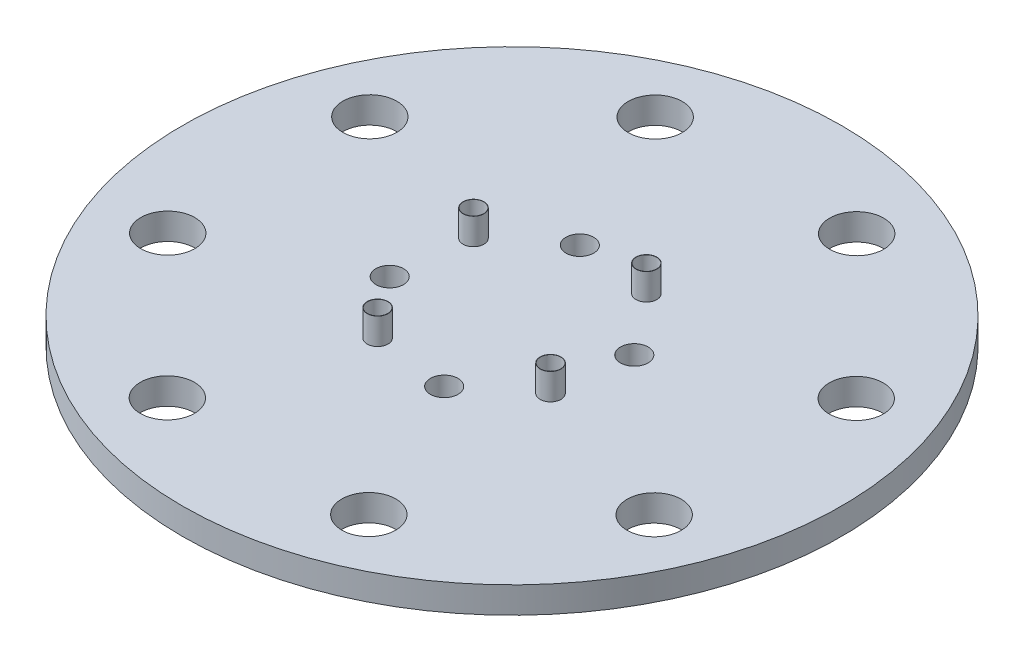
ISO-10303-21;
HEADER;
FILE_DESCRIPTION(('STEP AP214'),'2;1');
FILE_NAME('part.step','',(''),(''),'','','');
FILE_SCHEMA(('AUTOMOTIVE_DESIGN { 1 0 10303 214 1 1 1 1 }'));
ENDSEC;
DATA;
#1=APPLICATION_CONTEXT('core data for automotive mechanical design processes');
#2=APPLICATION_PROTOCOL_DEFINITION('international standard','automotive_design',2000,#1);
#3=PRODUCT_CONTEXT('',#1,'mechanical');
#4=PRODUCT('Part','Part','',(#3));
#5=PRODUCT_RELATED_PRODUCT_CATEGORY('part','',(#4));
#6=PRODUCT_DEFINITION_FORMATION('','',#4);
#7=PRODUCT_DEFINITION_CONTEXT('part definition',#1,'design');
#8=PRODUCT_DEFINITION('design','',#6,#7);
#9=PRODUCT_DEFINITION_SHAPE('','',#8);
#10=(LENGTH_UNIT() NAMED_UNIT(*) SI_UNIT(.MILLI.,.METRE.));
#11=(NAMED_UNIT(*) PLANE_ANGLE_UNIT() SI_UNIT($,.RADIAN.));
#12=(NAMED_UNIT(*) SI_UNIT($,.STERADIAN.) SOLID_ANGLE_UNIT());
#13=UNCERTAINTY_MEASURE_WITH_UNIT(LENGTH_MEASURE(1.E-05),#10,'distance_accuracy_value','');
#14=(GEOMETRIC_REPRESENTATION_CONTEXT(3) GLOBAL_UNCERTAINTY_ASSIGNED_CONTEXT((#13)) GLOBAL_UNIT_ASSIGNED_CONTEXT((#10,
#11,#12)) REPRESENTATION_CONTEXT('',''));
#15=CARTESIAN_POINT('',(0.,0.,0.));
#16=DIRECTION('',(0.,0.,1.));
#17=DIRECTION('',(1.,0.,0.));
#18=AXIS2_PLACEMENT_3D('',#15,#16,#17);
#19=CARTESIAN_POINT('',(0.,2.,0.));
#20=DIRECTION('',(0.,-1.,0.));
#21=DIRECTION('',(0.,0.,-1.));
#22=AXIS2_PLACEMENT_3D('',#19,#20,#21);
#23=CYLINDRICAL_SURFACE('',#22,25.);
#24=CARTESIAN_POINT('',(0.,2.,0.));
#25=DIRECTION('',(0.,1.,0.));
#26=DIRECTION('',(0.,0.,1.));
#27=AXIS2_PLACEMENT_3D('',#24,#25,#26);
#28=CIRCLE('',#27,25.);
#29=CARTESIAN_POINT('',(0.,2.,25.));
#30=VERTEX_POINT('',#29);
#31=EDGE_CURVE('E10',#30,#30,#28,.T.);
#32=ORIENTED_EDGE('',*,*,#31,.F.);
#33=EDGE_LOOP('',(#32));
#34=FACE_BOUND('',#33,.T.);
#35=CARTESIAN_POINT('',(0.,0.,0.));
#36=DIRECTION('',(0.,1.,0.));
#37=DIRECTION('',(0.,0.,1.));
#38=AXIS2_PLACEMENT_3D('',#35,#36,#37);
#39=CIRCLE('',#38,25.);
#40=CARTESIAN_POINT('',(0.,0.,25.));
#41=VERTEX_POINT('',#40);
#42=EDGE_CURVE('E44',#41,#41,#39,.T.);
#43=ORIENTED_EDGE('',*,*,#42,.T.);
#44=EDGE_LOOP('',(#43));
#45=FACE_BOUND('',#44,.T.);
#46=ADVANCED_FACE('F41',(#34,#45),#23,.T.);
#47=CARTESIAN_POINT('',(0.,2.,0.));
#48=DIRECTION('',(0.,1.,0.));
#49=DIRECTION('',(0.,0.,1.));
#50=AXIS2_PLACEMENT_3D('',#47,#48,#49);
#51=PLANE('',#50);
#52=CARTESIAN_POINT('',(-7.68064256948644,2.,18.4663946053315));
#53=DIRECTION('',(0.,-1.,0.));
#54=DIRECTION('',(0.,0.,-1.));
#55=AXIS2_PLACEMENT_3D('',#52,#53,#54);
#56=CIRCLE('',#55,2.05);
#57=CARTESIAN_POINT('',(-7.68064256948644,2.,16.4163946053315));
#58=VERTEX_POINT('',#57);
#59=EDGE_CURVE('E107',#58,#58,#56,.T.);
#60=ORIENTED_EDGE('',*,*,#59,.T.);
#61=EDGE_LOOP('',(#60));
#62=FACE_BOUND('',#61,.T.);
#63=CARTESIAN_POINT('',(7.62667840474221,2.,18.488747294251));
#64=DIRECTION('',(0.,-1.,0.));
#65=DIRECTION('',(0.,0.,-1.));
#66=AXIS2_PLACEMENT_3D('',#63,#64,#65);
#67=CIRCLE('',#66,2.05);
#68=CARTESIAN_POINT('',(7.62667840474221,2.,16.438747294251));
#69=VERTEX_POINT('',#68);
#70=EDGE_CURVE('E132',#69,#69,#67,.T.);
#71=ORIENTED_EDGE('',*,*,#70,.T.);
#72=EDGE_LOOP('',(#71));
#73=FACE_BOUND('',#72,.T.);
#74=CARTESIAN_POINT('',(18.4663946053311,2.,7.68064256948754));
#75=DIRECTION('',(0.,-1.,0.));
#76=DIRECTION('',(0.,0.,-1.));
#77=AXIS2_PLACEMENT_3D('',#74,#75,#76);
#78=CIRCLE('',#77,2.05);
#79=CARTESIAN_POINT('',(18.4663946053311,2.,5.63064256948754));
#80=VERTEX_POINT('',#79);
#81=EDGE_CURVE('E124',#80,#80,#78,.T.);
#82=ORIENTED_EDGE('',*,*,#81,.T.);
#83=EDGE_LOOP('',(#82));
#84=FACE_BOUND('',#83,.T.);
#85=CARTESIAN_POINT('',(18.4887472942505,2.,-7.62667840474111));
#86=DIRECTION('',(0.,-1.,0.));
#87=DIRECTION('',(0.,0.,-1.));
#88=AXIS2_PLACEMENT_3D('',#85,#86,#87);
#89=CIRCLE('',#88,2.05);
#90=CARTESIAN_POINT('',(18.4887472942505,2.,-9.67667840474111));
#91=VERTEX_POINT('',#90);
#92=EDGE_CURVE('E115',#91,#91,#89,.T.);
#93=ORIENTED_EDGE('',*,*,#92,.T.);
#94=EDGE_LOOP('',(#93));
#95=FACE_BOUND('',#94,.T.);
#96=CARTESIAN_POINT('',(7.6806425694871,2.,-18.46639460533));
#97=DIRECTION('',(0.,-1.,0.));
#98=DIRECTION('',(0.,0.,-1.));
#99=AXIS2_PLACEMENT_3D('',#96,#97,#98);
#100=CIRCLE('',#99,2.05);
#101=CARTESIAN_POINT('',(7.6806425694871,2.,-20.51639460533));
#102=VERTEX_POINT('',#101);
#103=EDGE_CURVE('E116',#102,#102,#100,.T.);
#104=ORIENTED_EDGE('',*,*,#103,.T.);
#105=EDGE_LOOP('',(#104));
#106=FACE_BOUND('',#105,.T.);
#107=CARTESIAN_POINT('',(-7.62667840474155,2.,-18.4887472942494));
#108=DIRECTION('',(0.,-1.,0.));
#109=DIRECTION('',(0.,0.,-1.));
#110=AXIS2_PLACEMENT_3D('',#107,#108,#109);
#111=CIRCLE('',#110,2.05);
#112=CARTESIAN_POINT('',(-7.62667840474155,2.,-20.5387472942494));
#113=VERTEX_POINT('',#112);
#114=EDGE_CURVE('E156',#113,#113,#111,.T.);
#115=ORIENTED_EDGE('',*,*,#114,.T.);
#116=EDGE_LOOP('',(#115));
#117=FACE_BOUND('',#116,.T.);
#118=CARTESIAN_POINT('',(-18.4663946053304,2.,-7.68064256948599));
#119=DIRECTION('',(0.,-1.,0.));
#120=DIRECTION('',(0.,0.,-1.));
#121=AXIS2_PLACEMENT_3D('',#118,#119,#120);
#122=CIRCLE('',#121,2.05);
#123=CARTESIAN_POINT('',(-18.4663946053304,2.,-9.73064256948599));
#124=VERTEX_POINT('',#123);
#125=EDGE_CURVE('E147',#124,#124,#122,.T.);
#126=ORIENTED_EDGE('',*,*,#125,.T.);
#127=EDGE_LOOP('',(#126));
#128=FACE_BOUND('',#127,.T.);
#129=CARTESIAN_POINT('',(-18.4887472942499,2.,7.62667840474266));
#130=DIRECTION('',(0.,-1.,0.));
#131=DIRECTION('',(0.,0.,-1.));
#132=AXIS2_PLACEMENT_3D('',#129,#130,#131);
#133=CIRCLE('',#132,2.05);
#134=CARTESIAN_POINT('',(-18.4887472942499,2.,5.57667840474266));
#135=VERTEX_POINT('',#134);
#136=EDGE_CURVE('E96',#135,#135,#133,.T.);
#137=ORIENTED_EDGE('',*,*,#136,.T.);
#138=EDGE_LOOP('',(#137));
#139=FACE_BOUND('',#138,.T.);
#140=CARTESIAN_POINT('',(-7.20972393812874,2.,2.06636897382066));
#141=DIRECTION('',(0.,1.,0.));
#142=DIRECTION('',(0.,0.,1.));
#143=AXIS2_PLACEMENT_3D('',#140,#141,#142);
#144=CIRCLE('',#143,1.05);
#145=CARTESIAN_POINT('',(-7.20972393812874,2.,3.11636897382066));
#146=VERTEX_POINT('',#145);
#147=EDGE_CURVE('E75',#146,#146,#144,.T.);
#148=ORIENTED_EDGE('',*,*,#147,.F.);
#149=EDGE_LOOP('',(#148));
#150=FACE_BOUND('',#149,.T.);
#151=CARTESIAN_POINT('',(2.06636897382105,2.,7.20972393812896));
#152=DIRECTION('',(0.,1.,0.));
#153=DIRECTION('',(0.,0.,1.));
#154=AXIS2_PLACEMENT_3D('',#151,#152,#153);
#155=CIRCLE('',#154,1.05);
#156=CARTESIAN_POINT('',(2.06636897382105,2.,8.25972393812896));
#157=VERTEX_POINT('',#156);
#158=EDGE_CURVE('E84',#157,#157,#155,.T.);
#159=ORIENTED_EDGE('',*,*,#158,.F.);
#160=EDGE_LOOP('',(#159));
#161=FACE_BOUND('',#160,.T.);
#162=CARTESIAN_POINT('',(7.20972393812935,2.,-2.06636897382083));
#163=DIRECTION('',(0.,1.,0.));
#164=DIRECTION('',(0.,0.,1.));
#165=AXIS2_PLACEMENT_3D('',#162,#163,#164);
#166=CIRCLE('',#165,1.05);
#167=CARTESIAN_POINT('',(7.20972393812935,2.,-1.01636897382083));
#168=VERTEX_POINT('',#167);
#169=EDGE_CURVE('E63',#168,#168,#166,.T.);
#170=ORIENTED_EDGE('',*,*,#169,.F.);
#171=EDGE_LOOP('',(#170));
#172=FACE_BOUND('',#171,.T.);
#173=CARTESIAN_POINT('',(-3.63690117331162,2.,6.55918820095631));
#174=DIRECTION('',(0.,1.,0.));
#175=DIRECTION('',(0.,0.,1.));
#176=AXIS2_PLACEMENT_3D('',#173,#174,#175);
#177=CIRCLE('',#176,0.79375);
#178=CARTESIAN_POINT('',(-3.63690117331162,2.,7.35293820095631));
#179=VERTEX_POINT('',#178);
#180=EDGE_CURVE('E59',#179,#179,#177,.T.);
#181=ORIENTED_EDGE('',*,*,#180,.F.);
#182=EDGE_LOOP('',(#181));
#183=FACE_BOUND('',#182,.T.);
#184=CARTESIAN_POINT('',(-6.5591882009563,2.,-3.63690117331165));
#185=DIRECTION('',(0.,1.,0.));
#186=DIRECTION('',(0.,0.,1.));
#187=AXIS2_PLACEMENT_3D('',#184,#185,#186);
#188=CIRCLE('',#187,0.79375);
#189=CARTESIAN_POINT('',(-6.5591882009563,2.,-2.84315117331165));
#190=VERTEX_POINT('',#189);
#191=EDGE_CURVE('E80',#190,#190,#188,.T.);
#192=ORIENTED_EDGE('',*,*,#191,.F.);
#193=EDGE_LOOP('',(#192));
#194=FACE_BOUND('',#193,.T.);
#195=CARTESIAN_POINT('',(3.63690117331167,2.,-6.55918820095629));
#196=DIRECTION('',(0.,1.,0.));
#197=DIRECTION('',(0.,0.,1.));
#198=AXIS2_PLACEMENT_3D('',#195,#196,#197);
#199=CIRCLE('',#198,0.79375);
#200=CARTESIAN_POINT('',(3.63690117331167,2.,-5.76543820095629));
#201=VERTEX_POINT('',#200);
#202=EDGE_CURVE('E95',#201,#201,#199,.T.);
#203=ORIENTED_EDGE('',*,*,#202,.F.);
#204=EDGE_LOOP('',(#203));
#205=FACE_BOUND('',#204,.T.);
#206=CARTESIAN_POINT('',(6.55918820095628,2.,3.63690117331169));
#207=DIRECTION('',(0.,1.,0.));
#208=DIRECTION('',(0.,0.,1.));
#209=AXIS2_PLACEMENT_3D('',#206,#207,#208);
#210=CIRCLE('',#209,0.79375);
#211=CARTESIAN_POINT('',(6.55918820095628,2.,4.43065117331169));
#212=VERTEX_POINT('',#211);
#213=EDGE_CURVE('E91',#212,#212,#210,.T.);
#214=ORIENTED_EDGE('',*,*,#213,.F.);
#215=EDGE_LOOP('',(#214));
#216=FACE_BOUND('',#215,.T.);
#217=CARTESIAN_POINT('',(-2.06636897382044,2.,-7.20972393812913));
#218=DIRECTION('',(0.,1.,0.));
#219=DIRECTION('',(0.,0.,1.));
#220=AXIS2_PLACEMENT_3D('',#217,#218,#219);
#221=CIRCLE('',#220,1.05);
#222=CARTESIAN_POINT('',(-2.06636897382044,2.,-6.15972393812913));
#223=VERTEX_POINT('',#222);
#224=EDGE_CURVE('E55',#223,#223,#221,.T.);
#225=ORIENTED_EDGE('',*,*,#224,.F.);
#226=EDGE_LOOP('',(#225));
#227=FACE_BOUND('',#226,.T.);
#228=ORIENTED_EDGE('',*,*,#31,.T.);
#229=EDGE_LOOP('',(#228));
#230=FACE_BOUND('',#229,.T.);
#231=ADVANCED_FACE('F232',(#62,#73,#84,#95,#106,#117,#128,#139,#150,#161,#172,#183,#194,#205,
#216,#227,#230),#51,.T.);
#232=CARTESIAN_POINT('',(0.,0.,0.));
#233=DIRECTION('',(0.,1.,0.));
#234=DIRECTION('',(0.,0.,1.));
#235=AXIS2_PLACEMENT_3D('',#232,#233,#234);
#236=PLANE('',#235);
#237=CARTESIAN_POINT('',(-7.68064256948644,0.,18.4663946053315));
#238=DIRECTION('',(0.,-1.,0.));
#239=DIRECTION('',(0.,0.,-1.));
#240=AXIS2_PLACEMENT_3D('',#237,#238,#239);
#241=CIRCLE('',#240,2.05);
#242=CARTESIAN_POINT('',(-7.68064256948644,0.,16.4163946053315));
#243=VERTEX_POINT('',#242);
#244=EDGE_CURVE('E136',#243,#243,#241,.T.);
#245=ORIENTED_EDGE('',*,*,#244,.F.);
#246=EDGE_LOOP('',(#245));
#247=FACE_BOUND('',#246,.T.);
#248=CARTESIAN_POINT('',(7.62667840474221,0.,18.488747294251));
#249=DIRECTION('',(0.,-1.,0.));
#250=DIRECTION('',(0.,0.,-1.));
#251=AXIS2_PLACEMENT_3D('',#248,#249,#250);
#252=CIRCLE('',#251,2.05);
#253=CARTESIAN_POINT('',(7.62667840474221,0.,16.438747294251));
#254=VERTEX_POINT('',#253);
#255=EDGE_CURVE('E128',#254,#254,#252,.T.);
#256=ORIENTED_EDGE('',*,*,#255,.F.);
#257=EDGE_LOOP('',(#256));
#258=FACE_BOUND('',#257,.T.);
#259=CARTESIAN_POINT('',(18.4663946053311,0.,7.68064256948754));
#260=DIRECTION('',(0.,-1.,0.));
#261=DIRECTION('',(0.,0.,-1.));
#262=AXIS2_PLACEMENT_3D('',#259,#260,#261);
#263=CIRCLE('',#262,2.05);
#264=CARTESIAN_POINT('',(18.4663946053311,0.,5.63064256948754));
#265=VERTEX_POINT('',#264);
#266=EDGE_CURVE('E120',#265,#265,#263,.T.);
#267=ORIENTED_EDGE('',*,*,#266,.F.);
#268=EDGE_LOOP('',(#267));
#269=FACE_BOUND('',#268,.T.);
#270=CARTESIAN_POINT('',(18.4887472942505,0.,-7.62667840474111));
#271=DIRECTION('',(0.,-1.,0.));
#272=DIRECTION('',(0.,0.,-1.));
#273=AXIS2_PLACEMENT_3D('',#270,#271,#272);
#274=CIRCLE('',#273,2.05);
#275=CARTESIAN_POINT('',(18.4887472942505,0.,-9.67667840474111));
#276=VERTEX_POINT('',#275);
#277=EDGE_CURVE('E111',#276,#276,#274,.T.);
#278=ORIENTED_EDGE('',*,*,#277,.F.);
#279=EDGE_LOOP('',(#278));
#280=FACE_BOUND('',#279,.T.);
#281=CARTESIAN_POINT('',(7.6806425694871,0.,-18.46639460533));
#282=DIRECTION('',(0.,-1.,0.));
#283=DIRECTION('',(0.,0.,-1.));
#284=AXIS2_PLACEMENT_3D('',#281,#282,#283);
#285=CIRCLE('',#284,2.05);
#286=CARTESIAN_POINT('',(7.6806425694871,0.,-20.51639460533));
#287=VERTEX_POINT('',#286);
#288=EDGE_CURVE('E160',#287,#287,#285,.T.);
#289=ORIENTED_EDGE('',*,*,#288,.F.);
#290=EDGE_LOOP('',(#289));
#291=FACE_BOUND('',#290,.T.);
#292=CARTESIAN_POINT('',(-7.62667840474155,0.,-18.4887472942494));
#293=DIRECTION('',(0.,-1.,0.));
#294=DIRECTION('',(0.,0.,-1.));
#295=AXIS2_PLACEMENT_3D('',#292,#293,#294);
#296=CIRCLE('',#295,2.05);
#297=CARTESIAN_POINT('',(-7.62667840474155,0.,-20.5387472942494));
#298=VERTEX_POINT('',#297);
#299=EDGE_CURVE('E152',#298,#298,#296,.T.);
#300=ORIENTED_EDGE('',*,*,#299,.F.);
#301=EDGE_LOOP('',(#300));
#302=FACE_BOUND('',#301,.T.);
#303=CARTESIAN_POINT('',(-18.4663946053304,0.,-7.68064256948599));
#304=DIRECTION('',(0.,-1.,0.));
#305=DIRECTION('',(0.,0.,-1.));
#306=AXIS2_PLACEMENT_3D('',#303,#304,#305);
#307=CIRCLE('',#306,2.05);
#308=CARTESIAN_POINT('',(-18.4663946053304,0.,-9.73064256948599));
#309=VERTEX_POINT('',#308);
#310=EDGE_CURVE('E143',#309,#309,#307,.T.);
#311=ORIENTED_EDGE('',*,*,#310,.F.);
#312=EDGE_LOOP('',(#311));
#313=FACE_BOUND('',#312,.T.);
#314=CARTESIAN_POINT('',(-18.4887472942499,0.,7.62667840474266));
#315=DIRECTION('',(0.,-1.,0.));
#316=DIRECTION('',(0.,0.,-1.));
#317=AXIS2_PLACEMENT_3D('',#314,#315,#316);
#318=CIRCLE('',#317,2.05);
#319=CARTESIAN_POINT('',(-18.4887472942499,0.,5.57667840474266));
#320=VERTEX_POINT('',#319);
#321=EDGE_CURVE('E103',#320,#320,#318,.T.);
#322=ORIENTED_EDGE('',*,*,#321,.F.);
#323=EDGE_LOOP('',(#322));
#324=FACE_BOUND('',#323,.T.);
#325=CARTESIAN_POINT('',(-7.20972393812874,0.,2.06636897382066));
#326=DIRECTION('',(0.,1.,0.));
#327=DIRECTION('',(0.,0.,1.));
#328=AXIS2_PLACEMENT_3D('',#325,#326,#327);
#329=CIRCLE('',#328,1.05);
#330=CARTESIAN_POINT('',(-7.20972393812874,0.,3.11636897382066));
#331=VERTEX_POINT('',#330);
#332=EDGE_CURVE('E79',#331,#331,#329,.T.);
#333=ORIENTED_EDGE('',*,*,#332,.T.);
#334=EDGE_LOOP('',(#333));
#335=FACE_BOUND('',#334,.T.);
#336=CARTESIAN_POINT('',(2.06636897382105,0.,7.20972393812896));
#337=DIRECTION('',(0.,1.,0.));
#338=DIRECTION('',(0.,0.,1.));
#339=AXIS2_PLACEMENT_3D('',#336,#337,#338);
#340=CIRCLE('',#339,1.05);
#341=CARTESIAN_POINT('',(2.06636897382105,0.,8.25972393812896));
#342=VERTEX_POINT('',#341);
#343=EDGE_CURVE('E68',#342,#342,#340,.T.);
#344=ORIENTED_EDGE('',*,*,#343,.T.);
#345=EDGE_LOOP('',(#344));
#346=FACE_BOUND('',#345,.T.);
#347=CARTESIAN_POINT('',(7.20972393812935,0.,-2.06636897382083));
#348=DIRECTION('',(0.,1.,0.));
#349=DIRECTION('',(0.,0.,1.));
#350=AXIS2_PLACEMENT_3D('',#347,#348,#349);
#351=CIRCLE('',#350,1.05);
#352=CARTESIAN_POINT('',(7.20972393812935,0.,-1.01636897382083));
#353=VERTEX_POINT('',#352);
#354=EDGE_CURVE('E67',#353,#353,#351,.T.);
#355=ORIENTED_EDGE('',*,*,#354,.T.);
#356=EDGE_LOOP('',(#355));
#357=FACE_BOUND('',#356,.T.);
#358=CARTESIAN_POINT('',(-2.06636897382044,0.,-7.20972393812913));
#359=DIRECTION('',(0.,1.,0.));
#360=DIRECTION('',(0.,0.,1.));
#361=AXIS2_PLACEMENT_3D('',#358,#359,#360);
#362=CIRCLE('',#361,1.05);
#363=CARTESIAN_POINT('',(-2.06636897382044,0.,-6.15972393812913));
#364=VERTEX_POINT('',#363);
#365=EDGE_CURVE('E53',#364,#364,#362,.T.);
#366=ORIENTED_EDGE('',*,*,#365,.T.);
#367=EDGE_LOOP('',(#366));
#368=FACE_BOUND('',#367,.T.);
#369=ORIENTED_EDGE('',*,*,#42,.F.);
#370=EDGE_LOOP('',(#369));
#371=FACE_BOUND('',#370,.T.);
#372=CARTESIAN_POINT('',(-3.63690117331162,0.,6.55918820095631));
#373=DIRECTION('',(0.,1.,0.));
#374=DIRECTION('',(0.,0.,1.));
#375=AXIS2_PLACEMENT_3D('',#372,#373,#374);
#376=CIRCLE('',#375,0.773750000000001);
#377=CARTESIAN_POINT('',(-3.63690117331162,0.,7.33293820095632));
#378=VERTEX_POINT('',#377);
#379=EDGE_CURVE('E171',#378,#378,#376,.T.);
#380=ORIENTED_EDGE('',*,*,#379,.T.);
#381=EDGE_LOOP('',(#380));
#382=FACE_BOUND('',#381,.T.);
#383=CARTESIAN_POINT('',(-6.5591882009563,0.,-3.63690117331165));
#384=DIRECTION('',(0.,1.,0.));
#385=DIRECTION('',(0.,0.,1.));
#386=AXIS2_PLACEMENT_3D('',#383,#384,#385);
#387=CIRCLE('',#386,0.77375);
#388=CARTESIAN_POINT('',(-6.5591882009563,0.,-2.86315117331165));
#389=VERTEX_POINT('',#388);
#390=EDGE_CURVE('E175',#389,#389,#387,.T.);
#391=ORIENTED_EDGE('',*,*,#390,.T.);
#392=EDGE_LOOP('',(#391));
#393=FACE_BOUND('',#392,.T.);
#394=CARTESIAN_POINT('',(6.55918820095628,0.,3.63690117331169));
#395=DIRECTION('',(0.,1.,0.));
#396=DIRECTION('',(0.,0.,1.));
#397=AXIS2_PLACEMENT_3D('',#394,#395,#396);
#398=CIRCLE('',#397,0.77375);
#399=CARTESIAN_POINT('',(6.55918820095628,0.,4.41065117331169));
#400=VERTEX_POINT('',#399);
#401=EDGE_CURVE('E190',#400,#400,#398,.T.);
#402=ORIENTED_EDGE('',*,*,#401,.T.);
#403=EDGE_LOOP('',(#402));
#404=FACE_BOUND('',#403,.T.);
#405=CARTESIAN_POINT('',(3.63690117331167,0.,-6.55918820095629));
#406=DIRECTION('',(0.,1.,0.));
#407=DIRECTION('',(0.,0.,1.));
#408=AXIS2_PLACEMENT_3D('',#405,#406,#407);
#409=CIRCLE('',#408,0.77375);
#410=CARTESIAN_POINT('',(3.63690117331167,0.,-5.78543820095629));
#411=VERTEX_POINT('',#410);
#412=EDGE_CURVE('E202',#411,#411,#409,.T.);
#413=ORIENTED_EDGE('',*,*,#412,.T.);
#414=EDGE_LOOP('',(#413));
#415=FACE_BOUND('',#414,.T.);
#416=ADVANCED_FACE('F238',(#247,#258,#269,#280,#291,#302,#313,#324,#335,#346,#357,#368,#371,
#382,#393,#404,#415),#236,.F.);
#417=CARTESIAN_POINT('',(-2.06636897382044,0.,-7.20972393812913));
#418=DIRECTION('',(0.,1.,0.));
#419=DIRECTION('',(0.,0.,1.));
#420=AXIS2_PLACEMENT_3D('',#417,#418,#419);
#421=CYLINDRICAL_SURFACE('',#420,1.05);
#422=ORIENTED_EDGE('',*,*,#365,.F.);
#423=EDGE_LOOP('',(#422));
#424=FACE_BOUND('',#423,.T.);
#425=ORIENTED_EDGE('',*,*,#224,.T.);
#426=EDGE_LOOP('',(#425));
#427=FACE_BOUND('',#426,.T.);
#428=ADVANCED_FACE('F246',(#424,#427),#421,.F.);
#429=CARTESIAN_POINT('',(7.20972393812935,0.,-2.06636897382083));
#430=DIRECTION('',(0.,1.,0.));
#431=DIRECTION('',(0.,0.,1.));
#432=AXIS2_PLACEMENT_3D('',#429,#430,#431);
#433=CYLINDRICAL_SURFACE('',#432,1.05);
#434=ORIENTED_EDGE('',*,*,#354,.F.);
#435=EDGE_LOOP('',(#434));
#436=FACE_BOUND('',#435,.T.);
#437=ORIENTED_EDGE('',*,*,#169,.T.);
#438=EDGE_LOOP('',(#437));
#439=FACE_BOUND('',#438,.T.);
#440=ADVANCED_FACE('F329',(#436,#439),#433,.F.);
#441=CARTESIAN_POINT('',(2.06636897382105,0.,7.20972393812896));
#442=DIRECTION('',(0.,1.,0.));
#443=DIRECTION('',(0.,0.,1.));
#444=AXIS2_PLACEMENT_3D('',#441,#442,#443);
#445=CYLINDRICAL_SURFACE('',#444,1.05);
#446=ORIENTED_EDGE('',*,*,#343,.F.);
#447=EDGE_LOOP('',(#446));
#448=FACE_BOUND('',#447,.T.);
#449=ORIENTED_EDGE('',*,*,#158,.T.);
#450=EDGE_LOOP('',(#449));
#451=FACE_BOUND('',#450,.T.);
#452=ADVANCED_FACE('F326',(#448,#451),#445,.F.);
#453=CARTESIAN_POINT('',(-7.20972393812874,0.,2.06636897382066));
#454=DIRECTION('',(0.,1.,0.));
#455=DIRECTION('',(0.,0.,1.));
#456=AXIS2_PLACEMENT_3D('',#453,#454,#455);
#457=CYLINDRICAL_SURFACE('',#456,1.05);
#458=ORIENTED_EDGE('',*,*,#332,.F.);
#459=EDGE_LOOP('',(#458));
#460=FACE_BOUND('',#459,.T.);
#461=ORIENTED_EDGE('',*,*,#147,.T.);
#462=EDGE_LOOP('',(#461));
#463=FACE_BOUND('',#462,.T.);
#464=ADVANCED_FACE('F324',(#460,#463),#457,.F.);
#465=CARTESIAN_POINT('',(-18.4887472942499,2.,7.62667840474266));
#466=DIRECTION('',(0.,-1.,0.));
#467=DIRECTION('',(0.,0.,-1.));
#468=AXIS2_PLACEMENT_3D('',#465,#466,#467);
#469=CYLINDRICAL_SURFACE('',#468,2.05);
#470=ORIENTED_EDGE('',*,*,#136,.F.);
#471=EDGE_LOOP('',(#470));
#472=FACE_BOUND('',#471,.T.);
#473=ORIENTED_EDGE('',*,*,#321,.T.);
#474=EDGE_LOOP('',(#473));
#475=FACE_BOUND('',#474,.T.);
#476=ADVANCED_FACE('F306',(#472,#475),#469,.F.);
#477=CARTESIAN_POINT('',(-18.4663946053304,2.,-7.68064256948599));
#478=DIRECTION('',(0.,-1.,0.));
#479=DIRECTION('',(0.,0.,-1.));
#480=AXIS2_PLACEMENT_3D('',#477,#478,#479);
#481=CYLINDRICAL_SURFACE('',#480,2.05);
#482=ORIENTED_EDGE('',*,*,#125,.F.);
#483=EDGE_LOOP('',(#482));
#484=FACE_BOUND('',#483,.T.);
#485=ORIENTED_EDGE('',*,*,#310,.T.);
#486=EDGE_LOOP('',(#485));
#487=FACE_BOUND('',#486,.T.);
#488=ADVANCED_FACE('F302',(#484,#487),#481,.F.);
#489=CARTESIAN_POINT('',(-7.62667840474155,2.,-18.4887472942494));
#490=DIRECTION('',(0.,-1.,0.));
#491=DIRECTION('',(0.,0.,-1.));
#492=AXIS2_PLACEMENT_3D('',#489,#490,#491);
#493=CYLINDRICAL_SURFACE('',#492,2.05);
#494=ORIENTED_EDGE('',*,*,#114,.F.);
#495=EDGE_LOOP('',(#494));
#496=FACE_BOUND('',#495,.T.);
#497=ORIENTED_EDGE('',*,*,#299,.T.);
#498=EDGE_LOOP('',(#497));
#499=FACE_BOUND('',#498,.T.);
#500=ADVANCED_FACE('F298',(#496,#499),#493,.F.);
#501=CARTESIAN_POINT('',(7.6806425694871,2.,-18.46639460533));
#502=DIRECTION('',(0.,-1.,0.));
#503=DIRECTION('',(0.,0.,-1.));
#504=AXIS2_PLACEMENT_3D('',#501,#502,#503);
#505=CYLINDRICAL_SURFACE('',#504,2.05);
#506=ORIENTED_EDGE('',*,*,#103,.F.);
#507=EDGE_LOOP('',(#506));
#508=FACE_BOUND('',#507,.T.);
#509=ORIENTED_EDGE('',*,*,#288,.T.);
#510=EDGE_LOOP('',(#509));
#511=FACE_BOUND('',#510,.T.);
#512=ADVANCED_FACE('F294',(#508,#511),#505,.F.);
#513=CARTESIAN_POINT('',(18.4887472942505,2.,-7.62667840474111));
#514=DIRECTION('',(0.,-1.,0.));
#515=DIRECTION('',(0.,0.,-1.));
#516=AXIS2_PLACEMENT_3D('',#513,#514,#515);
#517=CYLINDRICAL_SURFACE('',#516,2.05);
#518=ORIENTED_EDGE('',*,*,#92,.F.);
#519=EDGE_LOOP('',(#518));
#520=FACE_BOUND('',#519,.T.);
#521=ORIENTED_EDGE('',*,*,#277,.T.);
#522=EDGE_LOOP('',(#521));
#523=FACE_BOUND('',#522,.T.);
#524=ADVANCED_FACE('F297',(#520,#523),#517,.F.);
#525=CARTESIAN_POINT('',(18.4663946053311,2.,7.68064256948754));
#526=DIRECTION('',(0.,-1.,0.));
#527=DIRECTION('',(0.,0.,-1.));
#528=AXIS2_PLACEMENT_3D('',#525,#526,#527);
#529=CYLINDRICAL_SURFACE('',#528,2.05);
#530=ORIENTED_EDGE('',*,*,#81,.F.);
#531=EDGE_LOOP('',(#530));
#532=FACE_BOUND('',#531,.T.);
#533=ORIENTED_EDGE('',*,*,#266,.T.);
#534=EDGE_LOOP('',(#533));
#535=FACE_BOUND('',#534,.T.);
#536=ADVANCED_FACE('F314',(#532,#535),#529,.F.);
#537=CARTESIAN_POINT('',(7.62667840474221,2.,18.488747294251));
#538=DIRECTION('',(0.,-1.,0.));
#539=DIRECTION('',(0.,0.,-1.));
#540=AXIS2_PLACEMENT_3D('',#537,#538,#539);
#541=CYLINDRICAL_SURFACE('',#540,2.05);
#542=ORIENTED_EDGE('',*,*,#70,.F.);
#543=EDGE_LOOP('',(#542));
#544=FACE_BOUND('',#543,.T.);
#545=ORIENTED_EDGE('',*,*,#255,.T.);
#546=EDGE_LOOP('',(#545));
#547=FACE_BOUND('',#546,.T.);
#548=ADVANCED_FACE('F310',(#544,#547),#541,.F.);
#549=CARTESIAN_POINT('',(-7.68064256948644,2.,18.4663946053315));
#550=DIRECTION('',(0.,-1.,0.));
#551=DIRECTION('',(0.,0.,-1.));
#552=AXIS2_PLACEMENT_3D('',#549,#550,#551);
#553=CYLINDRICAL_SURFACE('',#552,2.05);
#554=ORIENTED_EDGE('',*,*,#59,.F.);
#555=EDGE_LOOP('',(#554));
#556=FACE_BOUND('',#555,.T.);
#557=ORIENTED_EDGE('',*,*,#244,.T.);
#558=EDGE_LOOP('',(#557));
#559=FACE_BOUND('',#558,.T.);
#560=ADVANCED_FACE('F289',(#556,#559),#553,.F.);
#561=CARTESIAN_POINT('',(-3.63690117331162,4.,6.55918820095631));
#562=DIRECTION('',(0.,1.,0.));
#563=DIRECTION('',(0.,0.,1.));
#564=AXIS2_PLACEMENT_3D('',#561,#562,#563);
#565=PLANE('',#564);
#566=CARTESIAN_POINT('',(-3.63690117331162,4.,6.55918820095631));
#567=DIRECTION('',(0.,1.,0.));
#568=DIRECTION('',(0.,0.,1.));
#569=AXIS2_PLACEMENT_3D('',#566,#567,#568);
#570=CIRCLE('',#569,0.793750000000001);
#571=CARTESIAN_POINT('',(-3.63690117331162,4.,7.35293820095631));
#572=VERTEX_POINT('',#571);
#573=EDGE_CURVE('E148',#572,#572,#570,.T.);
#574=ORIENTED_EDGE('',*,*,#573,.T.);
#575=EDGE_LOOP('',(#574));
#576=FACE_BOUND('',#575,.T.);
#577=CARTESIAN_POINT('',(-3.63690117331162,4.,6.55918820095631));
#578=DIRECTION('',(0.,1.,0.));
#579=DIRECTION('',(0.,0.,1.));
#580=AXIS2_PLACEMENT_3D('',#577,#578,#579);
#581=CIRCLE('',#580,0.773750000000001);
#582=CARTESIAN_POINT('',(-3.63690117331162,4.,7.33293820095632));
#583=VERTEX_POINT('',#582);
#584=EDGE_CURVE('E170',#583,#583,#581,.T.);
#585=ORIENTED_EDGE('',*,*,#584,.F.);
#586=EDGE_LOOP('',(#585));
#587=FACE_BOUND('',#586,.T.);
#588=ADVANCED_FACE('F286',(#576,#587),#565,.T.);
#589=CARTESIAN_POINT('',(-3.63690117331162,4.,6.55918820095631));
#590=DIRECTION('',(0.,-1.,0.));
#591=DIRECTION('',(0.,0.,-1.));
#592=AXIS2_PLACEMENT_3D('',#589,#590,#591);
#593=CYLINDRICAL_SURFACE('',#592,0.793750000000001);
#594=ORIENTED_EDGE('',*,*,#180,.T.);
#595=EDGE_LOOP('',(#594));
#596=FACE_BOUND('',#595,.T.);
#597=ORIENTED_EDGE('',*,*,#573,.F.);
#598=EDGE_LOOP('',(#597));
#599=FACE_BOUND('',#598,.T.);
#600=ADVANCED_FACE('F284',(#596,#599),#593,.T.);
#601=CARTESIAN_POINT('',(-3.63690117331162,4.,6.55918820095631));
#602=DIRECTION('',(0.,-1.,0.));
#603=DIRECTION('',(0.,0.,-1.));
#604=AXIS2_PLACEMENT_3D('',#601,#602,#603);
#605=CYLINDRICAL_SURFACE('',#604,0.773750000000001);
#606=ORIENTED_EDGE('',*,*,#584,.T.);
#607=EDGE_LOOP('',(#606));
#608=FACE_BOUND('',#607,.T.);
#609=ORIENTED_EDGE('',*,*,#379,.F.);
#610=EDGE_LOOP('',(#609));
#611=FACE_BOUND('',#610,.T.);
#612=ADVANCED_FACE('F277',(#608,#611),#605,.F.);
#613=CARTESIAN_POINT('',(-6.5591882009563,4.,-3.63690117331165));
#614=DIRECTION('',(0.,1.,0.));
#615=DIRECTION('',(0.,0.,1.));
#616=AXIS2_PLACEMENT_3D('',#613,#614,#615);
#617=PLANE('',#616);
#618=CARTESIAN_POINT('',(-6.5591882009563,4.,-3.63690117331165));
#619=DIRECTION('',(0.,1.,0.));
#620=DIRECTION('',(0.,0.,1.));
#621=AXIS2_PLACEMENT_3D('',#618,#619,#620);
#622=CIRCLE('',#621,0.79375);
#623=CARTESIAN_POINT('',(-6.5591882009563,4.,-2.84315117331165));
#624=VERTEX_POINT('',#623);
#625=EDGE_CURVE('E183',#624,#624,#622,.T.);
#626=ORIENTED_EDGE('',*,*,#625,.T.);
#627=EDGE_LOOP('',(#626));
#628=FACE_BOUND('',#627,.T.);
#629=CARTESIAN_POINT('',(-6.5591882009563,4.,-3.63690117331165));
#630=DIRECTION('',(0.,1.,0.));
#631=DIRECTION('',(0.,0.,1.));
#632=AXIS2_PLACEMENT_3D('',#629,#630,#631);
#633=CIRCLE('',#632,0.77375);
#634=CARTESIAN_POINT('',(-6.5591882009563,4.,-2.86315117331165));
#635=VERTEX_POINT('',#634);
#636=EDGE_CURVE('E179',#635,#635,#633,.T.);
#637=ORIENTED_EDGE('',*,*,#636,.F.);
#638=EDGE_LOOP('',(#637));
#639=FACE_BOUND('',#638,.T.);
#640=ADVANCED_FACE('F273',(#628,#639),#617,.T.);
#641=CARTESIAN_POINT('',(-6.5591882009563,4.,-3.63690117331165));
#642=DIRECTION('',(0.,-1.,0.));
#643=DIRECTION('',(0.,0.,-1.));
#644=AXIS2_PLACEMENT_3D('',#641,#642,#643);
#645=CYLINDRICAL_SURFACE('',#644,0.79375);
#646=ORIENTED_EDGE('',*,*,#191,.T.);
#647=EDGE_LOOP('',(#646));
#648=FACE_BOUND('',#647,.T.);
#649=ORIENTED_EDGE('',*,*,#625,.F.);
#650=EDGE_LOOP('',(#649));
#651=FACE_BOUND('',#650,.T.);
#652=ADVANCED_FACE('F269',(#648,#651),#645,.T.);
#653=CARTESIAN_POINT('',(-6.5591882009563,4.,-3.63690117331165));
#654=DIRECTION('',(0.,-1.,0.));
#655=DIRECTION('',(0.,0.,-1.));
#656=AXIS2_PLACEMENT_3D('',#653,#654,#655);
#657=CYLINDRICAL_SURFACE('',#656,0.77375);
#658=ORIENTED_EDGE('',*,*,#636,.T.);
#659=EDGE_LOOP('',(#658));
#660=FACE_BOUND('',#659,.T.);
#661=ORIENTED_EDGE('',*,*,#390,.F.);
#662=EDGE_LOOP('',(#661));
#663=FACE_BOUND('',#662,.T.);
#664=ADVANCED_FACE('F272',(#660,#663),#657,.F.);
#665=CARTESIAN_POINT('',(6.55918820095628,4.,3.63690117331169));
#666=DIRECTION('',(0.,1.,0.));
#667=DIRECTION('',(0.,0.,1.));
#668=AXIS2_PLACEMENT_3D('',#665,#666,#667);
#669=PLANE('',#668);
#670=CARTESIAN_POINT('',(6.55918820095628,4.,3.63690117331169));
#671=DIRECTION('',(0.,1.,0.));
#672=DIRECTION('',(0.,0.,1.));
#673=AXIS2_PLACEMENT_3D('',#670,#671,#672);
#674=CIRCLE('',#673,0.79375);
#675=CARTESIAN_POINT('',(6.55918820095628,4.,4.43065117331169));
#676=VERTEX_POINT('',#675);
#677=EDGE_CURVE('E195',#676,#676,#674,.T.);
#678=ORIENTED_EDGE('',*,*,#677,.T.);
#679=EDGE_LOOP('',(#678));
#680=FACE_BOUND('',#679,.T.);
#681=CARTESIAN_POINT('',(6.55918820095628,4.,3.63690117331169));
#682=DIRECTION('',(0.,1.,0.));
#683=DIRECTION('',(0.,0.,1.));
#684=AXIS2_PLACEMENT_3D('',#681,#682,#683);
#685=CIRCLE('',#684,0.77375);
#686=CARTESIAN_POINT('',(6.55918820095628,4.,4.41065117331169));
#687=VERTEX_POINT('',#686);
#688=EDGE_CURVE('E191',#687,#687,#685,.T.);
#689=ORIENTED_EDGE('',*,*,#688,.F.);
#690=EDGE_LOOP('',(#689));
#691=FACE_BOUND('',#690,.T.);
#692=ADVANCED_FACE('F264',(#680,#691),#669,.T.);
#693=CARTESIAN_POINT('',(6.55918820095628,4.,3.63690117331169));
#694=DIRECTION('',(0.,-1.,0.));
#695=DIRECTION('',(0.,0.,-1.));
#696=AXIS2_PLACEMENT_3D('',#693,#694,#695);
#697=CYLINDRICAL_SURFACE('',#696,0.79375);
#698=ORIENTED_EDGE('',*,*,#213,.T.);
#699=EDGE_LOOP('',(#698));
#700=FACE_BOUND('',#699,.T.);
#701=ORIENTED_EDGE('',*,*,#677,.F.);
#702=EDGE_LOOP('',(#701));
#703=FACE_BOUND('',#702,.T.);
#704=ADVANCED_FACE('F258',(#700,#703),#697,.T.);
#705=CARTESIAN_POINT('',(6.55918820095628,4.,3.63690117331169));
#706=DIRECTION('',(0.,-1.,0.));
#707=DIRECTION('',(0.,0.,-1.));
#708=AXIS2_PLACEMENT_3D('',#705,#706,#707);
#709=CYLINDRICAL_SURFACE('',#708,0.77375);
#710=ORIENTED_EDGE('',*,*,#688,.T.);
#711=EDGE_LOOP('',(#710));
#712=FACE_BOUND('',#711,.T.);
#713=ORIENTED_EDGE('',*,*,#401,.F.);
#714=EDGE_LOOP('',(#713));
#715=FACE_BOUND('',#714,.T.);
#716=ADVANCED_FACE('F229',(#712,#715),#709,.F.);
#717=CARTESIAN_POINT('',(3.63690117331167,4.,-6.55918820095629));
#718=DIRECTION('',(0.,1.,0.));
#719=DIRECTION('',(0.,0.,1.));
#720=AXIS2_PLACEMENT_3D('',#717,#718,#719);
#721=PLANE('',#720);
#722=CARTESIAN_POINT('',(3.63690117331167,4.,-6.55918820095629));
#723=DIRECTION('',(0.,1.,0.));
#724=DIRECTION('',(0.,0.,1.));
#725=AXIS2_PLACEMENT_3D('',#722,#723,#724);
#726=CIRCLE('',#725,0.79375);
#727=CARTESIAN_POINT('',(3.63690117331167,4.,-5.76543820095629));
#728=VERTEX_POINT('',#727);
#729=EDGE_CURVE('E207',#728,#728,#726,.T.);
#730=ORIENTED_EDGE('',*,*,#729,.T.);
#731=EDGE_LOOP('',(#730));
#732=FACE_BOUND('',#731,.T.);
#733=CARTESIAN_POINT('',(3.63690117331167,4.,-6.55918820095629));
#734=DIRECTION('',(0.,1.,0.));
#735=DIRECTION('',(0.,0.,1.));
#736=AXIS2_PLACEMENT_3D('',#733,#734,#735);
#737=CIRCLE('',#736,0.77375);
#738=CARTESIAN_POINT('',(3.63690117331167,4.,-5.78543820095629));
#739=VERTEX_POINT('',#738);
#740=EDGE_CURVE('E203',#739,#739,#737,.T.);
#741=ORIENTED_EDGE('',*,*,#740,.F.);
#742=EDGE_LOOP('',(#741));
#743=FACE_BOUND('',#742,.T.);
#744=ADVANCED_FACE('F215',(#732,#743),#721,.T.);
#745=CARTESIAN_POINT('',(3.63690117331167,4.,-6.55918820095629));
#746=DIRECTION('',(0.,-1.,0.));
#747=DIRECTION('',(0.,0.,-1.));
#748=AXIS2_PLACEMENT_3D('',#745,#746,#747);
#749=CYLINDRICAL_SURFACE('',#748,0.79375);
#750=ORIENTED_EDGE('',*,*,#202,.T.);
#751=EDGE_LOOP('',(#750));
#752=FACE_BOUND('',#751,.T.);
#753=ORIENTED_EDGE('',*,*,#729,.F.);
#754=EDGE_LOOP('',(#753));
#755=FACE_BOUND('',#754,.T.);
#756=ADVANCED_FACE('F218',(#752,#755),#749,.T.);
#757=CARTESIAN_POINT('',(3.63690117331167,4.,-6.55918820095629));
#758=DIRECTION('',(0.,-1.,0.));
#759=DIRECTION('',(0.,0.,-1.));
#760=AXIS2_PLACEMENT_3D('',#757,#758,#759);
#761=CYLINDRICAL_SURFACE('',#760,0.77375);
#762=ORIENTED_EDGE('',*,*,#740,.T.);
#763=EDGE_LOOP('',(#762));
#764=FACE_BOUND('',#763,.T.);
#765=ORIENTED_EDGE('',*,*,#412,.F.);
#766=EDGE_LOOP('',(#765));
#767=FACE_BOUND('',#766,.T.);
#768=ADVANCED_FACE('F220',(#764,#767),#761,.F.);
#769=CLOSED_SHELL('',(#46,#231,#416,#428,#440,#452,#464,#476,#488,#500,#512,#524,#536,#548,#560,
#588,#600,#612,#640,#652,#664,#692,#704,#716,#744,#756,#768));
#770=MANIFOLD_SOLID_BREP('B2',#769);
#771=ADVANCED_BREP_SHAPE_REPRESENTATION('',(#18,#770),#14);
#772=SHAPE_DEFINITION_REPRESENTATION(#9,#771);
ENDSEC;
END-ISO-10303-21;
